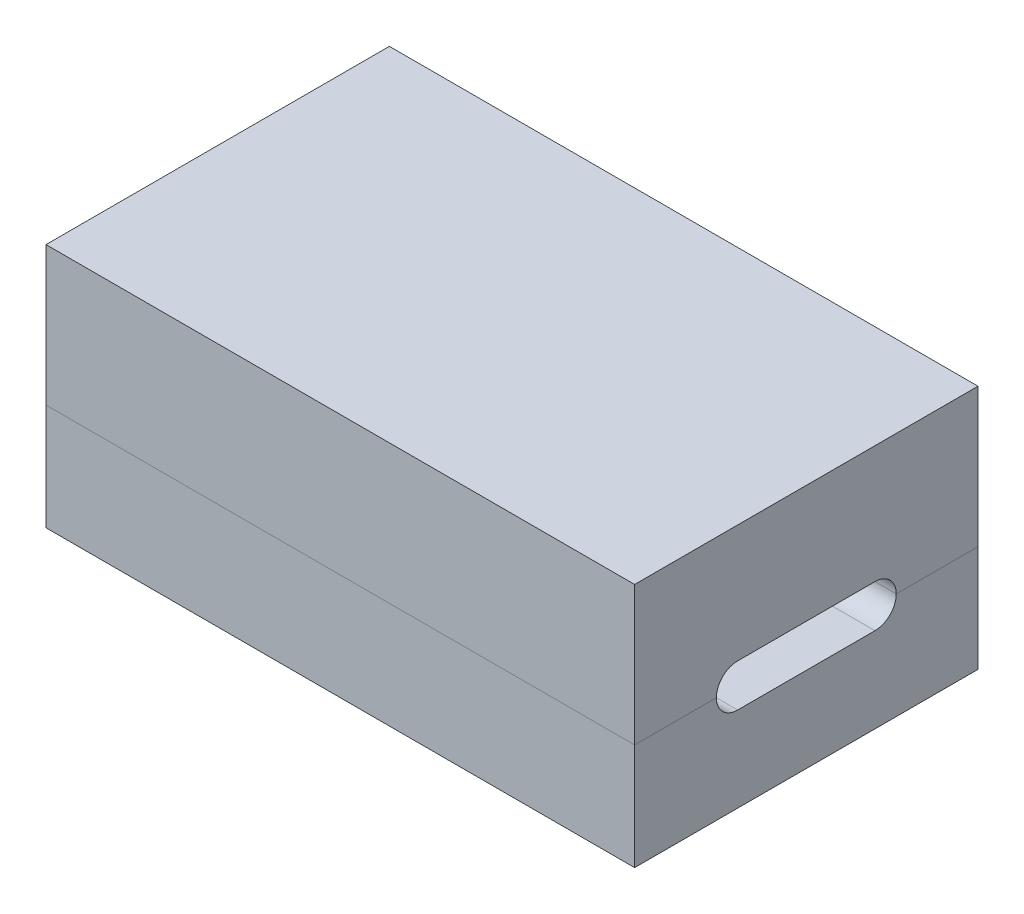
ISO-10303-21;
HEADER;
FILE_DESCRIPTION(('STEP AP214'),'2;1');
FILE_NAME('part.step','',(''),(''),'','','');
FILE_SCHEMA(('AUTOMOTIVE_DESIGN { 1 0 10303 214 1 1 1 1 }'));
ENDSEC;
DATA;
#1=APPLICATION_CONTEXT('core data for automotive mechanical design processes');
#2=APPLICATION_PROTOCOL_DEFINITION('international standard','automotive_design',2000,#1);
#3=PRODUCT_CONTEXT('',#1,'mechanical');
#4=PRODUCT('Part','Part','',(#3));
#5=PRODUCT_RELATED_PRODUCT_CATEGORY('part','',(#4));
#6=PRODUCT_DEFINITION_FORMATION('','',#4);
#7=PRODUCT_DEFINITION_CONTEXT('part definition',#1,'design');
#8=PRODUCT_DEFINITION('design','',#6,#7);
#9=PRODUCT_DEFINITION_SHAPE('','',#8);
#10=(LENGTH_UNIT() NAMED_UNIT(*) SI_UNIT(.MILLI.,.METRE.));
#11=(NAMED_UNIT(*) PLANE_ANGLE_UNIT() SI_UNIT($,.RADIAN.));
#12=(NAMED_UNIT(*) SI_UNIT($,.STERADIAN.) SOLID_ANGLE_UNIT());
#13=UNCERTAINTY_MEASURE_WITH_UNIT(LENGTH_MEASURE(1.E-05),#10,'distance_accuracy_value','');
#14=(GEOMETRIC_REPRESENTATION_CONTEXT(3) GLOBAL_UNCERTAINTY_ASSIGNED_CONTEXT((#13)) GLOBAL_UNIT_ASSIGNED_CONTEXT((#10,
#11,#12)) REPRESENTATION_CONTEXT('',''));
#15=CARTESIAN_POINT('',(0.,0.,0.));
#16=DIRECTION('',(0.,0.,1.));
#17=DIRECTION('',(1.,0.,0.));
#18=AXIS2_PLACEMENT_3D('',#15,#16,#17);
#19=CARTESIAN_POINT('',(0.,6.5,0.));
#20=DIRECTION('',(0.,1.,0.));
#21=DIRECTION('',(0.,0.,1.));
#22=AXIS2_PLACEMENT_3D('',#19,#20,#21);
#23=PLANE('',#22);
#24=DIRECTION('',(0.,0.,-1.));
#25=VECTOR('',#24,1.);
#26=CARTESIAN_POINT('',(15.,6.5,-7.5));
#27=LINE('',#26,#25);
#28=CARTESIAN_POINT('',(15.,6.5,-5.5));
#29=VERTEX_POINT('',#28);
#30=CARTESIAN_POINT('',(15.,6.5,-7.5));
#31=VERTEX_POINT('',#30);
#32=EDGE_CURVE('E169',#29,#31,#27,.T.);
#33=ORIENTED_EDGE('',*,*,#32,.F.);
#34=DIRECTION('',(1.,0.,0.));
#35=VECTOR('',#34,1.);
#36=CARTESIAN_POINT('',(3.,6.5,-5.5));
#37=LINE('',#36,#35);
#38=CARTESIAN_POINT('',(18.,6.5,-5.5));
#39=VERTEX_POINT('',#38);
#40=EDGE_CURVE('E181',#29,#39,#37,.T.);
#41=ORIENTED_EDGE('',*,*,#40,.T.);
#42=DIRECTION('',(0.,0.,-1.));
#43=VECTOR('',#42,1.);
#44=CARTESIAN_POINT('',(18.,6.5,-10.5));
#45=LINE('',#44,#43);
#46=CARTESIAN_POINT('',(18.,6.5,-10.5));
#47=VERTEX_POINT('',#46);
#48=EDGE_CURVE('E201',#39,#47,#45,.T.);
#49=ORIENTED_EDGE('',*,*,#48,.T.);
#50=DIRECTION('',(-1.,0.,0.));
#51=VECTOR('',#50,1.);
#52=CARTESIAN_POINT('',(-18.,6.5,-10.5));
#53=LINE('',#52,#51);
#54=CARTESIAN_POINT('',(-18.,6.5,-10.5));
#55=VERTEX_POINT('',#54);
#56=EDGE_CURVE('E205',#47,#55,#53,.T.);
#57=ORIENTED_EDGE('',*,*,#56,.T.);
#58=DIRECTION('',(0.,0.,1.));
#59=VECTOR('',#58,1.);
#60=CARTESIAN_POINT('',(-18.,6.5,-10.5));
#61=LINE('',#60,#59);
#62=CARTESIAN_POINT('',(-18.,6.5,10.5));
#63=VERTEX_POINT('',#62);
#64=EDGE_CURVE('E208',#55,#63,#61,.T.);
#65=ORIENTED_EDGE('',*,*,#64,.T.);
#66=DIRECTION('',(1.,0.,0.));
#67=VECTOR('',#66,1.);
#68=CARTESIAN_POINT('',(-18.,6.5,10.5));
#69=LINE('',#68,#67);
#70=CARTESIAN_POINT('',(18.,6.5,10.5));
#71=VERTEX_POINT('',#70);
#72=EDGE_CURVE('E211',#63,#71,#69,.T.);
#73=ORIENTED_EDGE('',*,*,#72,.T.);
#74=CARTESIAN_POINT('',(18.,6.5,5.5));
#75=VERTEX_POINT('',#74);
#76=EDGE_CURVE('E204',#71,#75,#45,.T.);
#77=ORIENTED_EDGE('',*,*,#76,.T.);
#78=DIRECTION('',(1.,0.,0.));
#79=VECTOR('',#78,1.);
#80=CARTESIAN_POINT('',(3.,6.5,5.5));
#81=LINE('',#80,#79);
#82=CARTESIAN_POINT('',(15.,6.5,5.5));
#83=VERTEX_POINT('',#82);
#84=EDGE_CURVE('E214',#75,#83,#81,.F.);
#85=ORIENTED_EDGE('',*,*,#84,.T.);
#86=CARTESIAN_POINT('',(15.,6.5,7.5));
#87=VERTEX_POINT('',#86);
#88=EDGE_CURVE('E161',#87,#83,#27,.T.);
#89=ORIENTED_EDGE('',*,*,#88,.F.);
#90=DIRECTION('',(1.,0.,0.));
#91=VECTOR('',#90,1.);
#92=CARTESIAN_POINT('',(-15.,6.5,7.5));
#93=LINE('',#92,#91);
#94=CARTESIAN_POINT('',(-15.,6.5,7.5));
#95=VERTEX_POINT('',#94);
#96=EDGE_CURVE('E167',#95,#87,#93,.T.);
#97=ORIENTED_EDGE('',*,*,#96,.F.);
#98=DIRECTION('',(0.,0.,1.));
#99=VECTOR('',#98,1.);
#100=CARTESIAN_POINT('',(-15.,6.5,-7.5));
#101=LINE('',#100,#99);
#102=CARTESIAN_POINT('',(-15.,6.5,-7.5));
#103=VERTEX_POINT('',#102);
#104=EDGE_CURVE('E141',#103,#95,#101,.T.);
#105=ORIENTED_EDGE('',*,*,#104,.F.);
#106=DIRECTION('',(-1.,0.,0.));
#107=VECTOR('',#106,1.);
#108=CARTESIAN_POINT('',(-15.,6.5,-7.5));
#109=LINE('',#108,#107);
#110=EDGE_CURVE('E158',#31,#103,#109,.T.);
#111=ORIENTED_EDGE('',*,*,#110,.F.);
#112=EDGE_LOOP('',(#33,#41,#49,#57,#65,#73,#77,#85,#89,#97,#105,#111));
#113=FACE_BOUND('',#112,.T.);
#114=ADVANCED_FACE('F45',(#113),#23,.T.);
#115=CARTESIAN_POINT('',(-18.,15.,-10.5));
#116=DIRECTION('',(0.,0.,1.));
#117=DIRECTION('',(1.,0.,0.));
#118=AXIS2_PLACEMENT_3D('',#115,#116,#117);
#119=PLANE('',#118);
#120=ORIENTED_EDGE('',*,*,#56,.F.);
#121=DIRECTION('',(0.,-1.,0.));
#122=VECTOR('',#121,1.);
#123=CARTESIAN_POINT('',(18.,15.,-10.5));
#124=LINE('',#123,#122);
#125=CARTESIAN_POINT('',(18.,0.,-10.5));
#126=VERTEX_POINT('',#125);
#127=EDGE_CURVE('E218',#47,#126,#124,.T.);
#128=ORIENTED_EDGE('',*,*,#127,.T.);
#129=DIRECTION('',(-1.,0.,0.));
#130=VECTOR('',#129,1.);
#131=CARTESIAN_POINT('',(-18.,0.,-10.5));
#132=LINE('',#131,#130);
#133=CARTESIAN_POINT('',(-18.,0.,-10.5));
#134=VERTEX_POINT('',#133);
#135=EDGE_CURVE('E189',#126,#134,#132,.T.);
#136=ORIENTED_EDGE('',*,*,#135,.T.);
#137=DIRECTION('',(0.,-1.,0.));
#138=VECTOR('',#137,1.);
#139=CARTESIAN_POINT('',(-18.,15.,-10.5));
#140=LINE('',#139,#138);
#141=EDGE_CURVE('E220',#55,#134,#140,.T.);
#142=ORIENTED_EDGE('',*,*,#141,.F.);
#143=EDGE_LOOP('',(#120,#128,#136,#142));
#144=FACE_BOUND('',#143,.T.);
#145=ADVANCED_FACE('F245',(#144),#119,.F.);
#146=CARTESIAN_POINT('',(18.,15.,-10.5));
#147=DIRECTION('',(-1.,0.,0.));
#148=DIRECTION('',(0.,0.,1.));
#149=AXIS2_PLACEMENT_3D('',#146,#147,#148);
#150=PLANE('',#149);
#151=ORIENTED_EDGE('',*,*,#76,.F.);
#152=DIRECTION('',(0.,-1.,0.));
#153=VECTOR('',#152,1.);
#154=CARTESIAN_POINT('',(18.,15.,10.5));
#155=LINE('',#154,#153);
#156=CARTESIAN_POINT('',(18.,0.,10.5));
#157=VERTEX_POINT('',#156);
#158=EDGE_CURVE('E186',#71,#157,#155,.T.);
#159=ORIENTED_EDGE('',*,*,#158,.T.);
#160=DIRECTION('',(0.,0.,-1.));
#161=VECTOR('',#160,1.);
#162=CARTESIAN_POINT('',(18.,0.,-10.5));
#163=LINE('',#162,#161);
#164=EDGE_CURVE('E192',#157,#126,#163,.T.);
#165=ORIENTED_EDGE('',*,*,#164,.T.);
#166=ORIENTED_EDGE('',*,*,#127,.F.);
#167=ORIENTED_EDGE('',*,*,#48,.F.);
#168=CARTESIAN_POINT('',(18.,6.5,-4.2));
#169=DIRECTION('',(1.,0.,0.));
#170=DIRECTION('',(0.,0.,-1.));
#171=AXIS2_PLACEMENT_3D('',#168,#169,#170);
#172=CIRCLE('',#171,1.3);
#173=CARTESIAN_POINT('',(18.,5.2,-4.2));
#174=VERTEX_POINT('',#173);
#175=EDGE_CURVE('E197',#174,#39,#172,.T.);
#176=ORIENTED_EDGE('',*,*,#175,.F.);
#177=DIRECTION('',(0.,0.,-1.));
#178=VECTOR('',#177,1.);
#179=CARTESIAN_POINT('',(18.,5.2,4.2));
#180=LINE('',#179,#178);
#181=CARTESIAN_POINT('',(18.,5.2,4.2));
#182=VERTEX_POINT('',#181);
#183=EDGE_CURVE('E199',#182,#174,#180,.T.);
#184=ORIENTED_EDGE('',*,*,#183,.F.);
#185=CARTESIAN_POINT('',(18.,6.5,4.2));
#186=DIRECTION('',(1.,0.,0.));
#187=DIRECTION('',(0.,0.,-1.));
#188=AXIS2_PLACEMENT_3D('',#185,#186,#187);
#189=CIRCLE('',#188,1.3);
#190=EDGE_CURVE('E53',#75,#182,#189,.T.);
#191=ORIENTED_EDGE('',*,*,#190,.F.);
#192=EDGE_LOOP('',(#151,#159,#165,#166,#167,#176,#184,#191));
#193=FACE_BOUND('',#192,.T.);
#194=ADVANCED_FACE('F235',(#193),#150,.F.);
#195=CARTESIAN_POINT('',(3.,5.2,4.2));
#196=DIRECTION('',(0.,-1.,0.));
#197=DIRECTION('',(0.,0.,-1.));
#198=AXIS2_PLACEMENT_3D('',#195,#196,#197);
#199=PLANE('',#198);
#200=DIRECTION('',(1.,0.,0.));
#201=VECTOR('',#200,1.);
#202=CARTESIAN_POINT('',(3.,5.2,-4.2));
#203=LINE('',#202,#201);
#204=CARTESIAN_POINT('',(15.,5.2,-4.2));
#205=VERTEX_POINT('',#204);
#206=EDGE_CURVE('E66',#205,#174,#203,.T.);
#207=ORIENTED_EDGE('',*,*,#206,.F.);
#208=DIRECTION('',(0.,0.,1.));
#209=VECTOR('',#208,1.);
#210=CARTESIAN_POINT('',(15.,5.2,4.2));
#211=LINE('',#210,#209);
#212=CARTESIAN_POINT('',(15.,5.2,4.2));
#213=VERTEX_POINT('',#212);
#214=EDGE_CURVE('E60',#205,#213,#211,.T.);
#215=ORIENTED_EDGE('',*,*,#214,.T.);
#216=DIRECTION('',(1.,0.,0.));
#217=VECTOR('',#216,1.);
#218=CARTESIAN_POINT('',(3.,5.2,4.2));
#219=LINE('',#218,#217);
#220=EDGE_CURVE('E195',#213,#182,#219,.T.);
#221=ORIENTED_EDGE('',*,*,#220,.T.);
#222=ORIENTED_EDGE('',*,*,#183,.T.);
#223=EDGE_LOOP('',(#207,#215,#221,#222));
#224=FACE_BOUND('',#223,.T.);
#225=ADVANCED_FACE('F238',(#224),#199,.F.);
#226=CARTESIAN_POINT('',(3.,6.5,4.2));
#227=DIRECTION('',(1.,0.,0.));
#228=DIRECTION('',(0.,0.,-1.));
#229=AXIS2_PLACEMENT_3D('',#226,#227,#228);
#230=CYLINDRICAL_SURFACE('',#229,1.3);
#231=ORIENTED_EDGE('',*,*,#220,.F.);
#232=CARTESIAN_POINT('',(15.,6.5,4.2));
#233=DIRECTION('',(1.,0.,0.));
#234=DIRECTION('',(0.,0.,-1.));
#235=AXIS2_PLACEMENT_3D('',#232,#233,#234);
#236=CIRCLE('',#235,1.3);
#237=EDGE_CURVE('E178',#213,#83,#236,.F.);
#238=ORIENTED_EDGE('',*,*,#237,.T.);
#239=ORIENTED_EDGE('',*,*,#84,.F.);
#240=ORIENTED_EDGE('',*,*,#190,.T.);
#241=EDGE_LOOP('',(#231,#238,#239,#240));
#242=FACE_BOUND('',#241,.T.);
#243=ADVANCED_FACE('F230',(#242),#230,.F.);
#244=CARTESIAN_POINT('',(3.,6.5,-4.2));
#245=DIRECTION('',(1.,0.,0.));
#246=DIRECTION('',(0.,0.,-1.));
#247=AXIS2_PLACEMENT_3D('',#244,#245,#246);
#248=CYLINDRICAL_SURFACE('',#247,1.3);
#249=ORIENTED_EDGE('',*,*,#40,.F.);
#250=CARTESIAN_POINT('',(15.,6.5,-4.2));
#251=DIRECTION('',(1.,0.,0.));
#252=DIRECTION('',(0.,0.,-1.));
#253=AXIS2_PLACEMENT_3D('',#250,#251,#252);
#254=CIRCLE('',#253,1.3);
#255=EDGE_CURVE('E12',#29,#205,#254,.F.);
#256=ORIENTED_EDGE('',*,*,#255,.T.);
#257=ORIENTED_EDGE('',*,*,#206,.T.);
#258=ORIENTED_EDGE('',*,*,#175,.T.);
#259=EDGE_LOOP('',(#249,#256,#257,#258));
#260=FACE_BOUND('',#259,.T.);
#261=ADVANCED_FACE('F47',(#260),#248,.F.);
#262=CARTESIAN_POINT('',(0.,0.,0.));
#263=DIRECTION('',(0.,1.,0.));
#264=DIRECTION('',(0.,0.,1.));
#265=AXIS2_PLACEMENT_3D('',#262,#263,#264);
#266=PLANE('',#265);
#267=ORIENTED_EDGE('',*,*,#164,.F.);
#268=DIRECTION('',(1.,0.,0.));
#269=VECTOR('',#268,1.);
#270=CARTESIAN_POINT('',(-18.,0.,10.5));
#271=LINE('',#270,#269);
#272=CARTESIAN_POINT('',(-18.,0.,10.5));
#273=VERTEX_POINT('',#272);
#274=EDGE_CURVE('E182',#273,#157,#271,.T.);
#275=ORIENTED_EDGE('',*,*,#274,.F.);
#276=DIRECTION('',(0.,0.,1.));
#277=VECTOR('',#276,1.);
#278=CARTESIAN_POINT('',(-18.,0.,-10.5));
#279=LINE('',#278,#277);
#280=EDGE_CURVE('E185',#134,#273,#279,.T.);
#281=ORIENTED_EDGE('',*,*,#280,.F.);
#282=ORIENTED_EDGE('',*,*,#135,.F.);
#283=EDGE_LOOP('',(#267,#275,#281,#282));
#284=FACE_BOUND('',#283,.T.);
#285=ADVANCED_FACE('F263',(#284),#266,.F.);
#286=CARTESIAN_POINT('',(-18.,15.,-10.5));
#287=DIRECTION('',(1.,0.,0.));
#288=DIRECTION('',(0.,0.,-1.));
#289=AXIS2_PLACEMENT_3D('',#286,#287,#288);
#290=PLANE('',#289);
#291=ORIENTED_EDGE('',*,*,#64,.F.);
#292=ORIENTED_EDGE('',*,*,#141,.T.);
#293=ORIENTED_EDGE('',*,*,#280,.T.);
#294=DIRECTION('',(0.,-1.,0.));
#295=VECTOR('',#294,1.);
#296=CARTESIAN_POINT('',(-18.,15.,10.5));
#297=LINE('',#296,#295);
#298=EDGE_CURVE('E222',#63,#273,#297,.T.);
#299=ORIENTED_EDGE('',*,*,#298,.F.);
#300=EDGE_LOOP('',(#291,#292,#293,#299));
#301=FACE_BOUND('',#300,.T.);
#302=ADVANCED_FACE('F260',(#301),#290,.F.);
#303=CARTESIAN_POINT('',(-18.,15.,10.5));
#304=DIRECTION('',(0.,0.,-1.));
#305=DIRECTION('',(-1.,0.,0.));
#306=AXIS2_PLACEMENT_3D('',#303,#304,#305);
#307=PLANE('',#306);
#308=ORIENTED_EDGE('',*,*,#72,.F.);
#309=ORIENTED_EDGE('',*,*,#298,.T.);
#310=ORIENTED_EDGE('',*,*,#274,.T.);
#311=ORIENTED_EDGE('',*,*,#158,.F.);
#312=EDGE_LOOP('',(#308,#309,#310,#311));
#313=FACE_BOUND('',#312,.T.);
#314=ADVANCED_FACE('F257',(#313),#307,.F.);
#315=CARTESIAN_POINT('',(15.,3.,-7.5));
#316=DIRECTION('',(1.,0.,0.));
#317=DIRECTION('',(0.,0.,-1.));
#318=AXIS2_PLACEMENT_3D('',#315,#316,#317);
#319=PLANE('',#318);
#320=ORIENTED_EDGE('',*,*,#214,.F.);
#321=ORIENTED_EDGE('',*,*,#255,.F.);
#322=ORIENTED_EDGE('',*,*,#32,.T.);
#323=DIRECTION('',(0.,1.,0.));
#324=VECTOR('',#323,1.);
#325=CARTESIAN_POINT('',(15.,3.,-7.5));
#326=LINE('',#325,#324);
#327=CARTESIAN_POINT('',(15.,3.,-7.5));
#328=VERTEX_POINT('',#327);
#329=EDGE_CURVE('E173',#328,#31,#326,.T.);
#330=ORIENTED_EDGE('',*,*,#329,.F.);
#331=DIRECTION('',(0.,0.,-1.));
#332=VECTOR('',#331,1.);
#333=CARTESIAN_POINT('',(15.,3.,-7.5));
#334=LINE('',#333,#332);
#335=CARTESIAN_POINT('',(15.,3.,7.5));
#336=VERTEX_POINT('',#335);
#337=EDGE_CURVE('E154',#336,#328,#334,.T.);
#338=ORIENTED_EDGE('',*,*,#337,.F.);
#339=DIRECTION('',(0.,1.,0.));
#340=VECTOR('',#339,1.);
#341=CARTESIAN_POINT('',(15.,3.,7.5));
#342=LINE('',#341,#340);
#343=EDGE_CURVE('E145',#336,#87,#342,.T.);
#344=ORIENTED_EDGE('',*,*,#343,.T.);
#345=ORIENTED_EDGE('',*,*,#88,.T.);
#346=ORIENTED_EDGE('',*,*,#237,.F.);
#347=EDGE_LOOP('',(#320,#321,#322,#330,#338,#344,#345,#346));
#348=FACE_BOUND('',#347,.T.);
#349=ADVANCED_FACE('F256',(#348),#319,.F.);
#350=CARTESIAN_POINT('',(-15.,3.,-7.5));
#351=DIRECTION('',(-1.,0.,0.));
#352=DIRECTION('',(0.,0.,1.));
#353=AXIS2_PLACEMENT_3D('',#350,#351,#352);
#354=PLANE('',#353);
#355=ORIENTED_EDGE('',*,*,#104,.T.);
#356=DIRECTION('',(0.,1.,0.));
#357=VECTOR('',#356,1.);
#358=CARTESIAN_POINT('',(-15.,3.,7.5));
#359=LINE('',#358,#357);
#360=CARTESIAN_POINT('',(-15.,3.,7.5));
#361=VERTEX_POINT('',#360);
#362=EDGE_CURVE('E134',#361,#95,#359,.T.);
#363=ORIENTED_EDGE('',*,*,#362,.F.);
#364=DIRECTION('',(0.,0.,1.));
#365=VECTOR('',#364,1.);
#366=CARTESIAN_POINT('',(-15.,3.,-7.5));
#367=LINE('',#366,#365);
#368=CARTESIAN_POINT('',(-15.,3.,-7.5));
#369=VERTEX_POINT('',#368);
#370=EDGE_CURVE('E138',#369,#361,#367,.T.);
#371=ORIENTED_EDGE('',*,*,#370,.F.);
#372=DIRECTION('',(0.,1.,0.));
#373=VECTOR('',#372,1.);
#374=CARTESIAN_POINT('',(-15.,3.,-7.5));
#375=LINE('',#374,#373);
#376=EDGE_CURVE('E171',#369,#103,#375,.T.);
#377=ORIENTED_EDGE('',*,*,#376,.T.);
#378=EDGE_LOOP('',(#355,#363,#371,#377));
#379=FACE_BOUND('',#378,.T.);
#380=ADVANCED_FACE('F136',(#379),#354,.F.);
#381=CARTESIAN_POINT('',(-15.,3.,-7.5));
#382=DIRECTION('',(0.,0.,-1.));
#383=DIRECTION('',(-1.,0.,0.));
#384=AXIS2_PLACEMENT_3D('',#381,#382,#383);
#385=PLANE('',#384);
#386=ORIENTED_EDGE('',*,*,#110,.T.);
#387=ORIENTED_EDGE('',*,*,#376,.F.);
#388=DIRECTION('',(-1.,0.,0.));
#389=VECTOR('',#388,1.);
#390=CARTESIAN_POINT('',(-15.,3.,-7.5));
#391=LINE('',#390,#389);
#392=EDGE_CURVE('E146',#328,#369,#391,.T.);
#393=ORIENTED_EDGE('',*,*,#392,.F.);
#394=ORIENTED_EDGE('',*,*,#329,.T.);
#395=EDGE_LOOP('',(#386,#387,#393,#394));
#396=FACE_BOUND('',#395,.T.);
#397=ADVANCED_FACE('F290',(#396),#385,.F.);
#398=CARTESIAN_POINT('',(-15.,3.,7.5));
#399=DIRECTION('',(0.,0.,1.));
#400=DIRECTION('',(1.,0.,0.));
#401=AXIS2_PLACEMENT_3D('',#398,#399,#400);
#402=PLANE('',#401);
#403=ORIENTED_EDGE('',*,*,#96,.T.);
#404=ORIENTED_EDGE('',*,*,#343,.F.);
#405=DIRECTION('',(1.,0.,0.));
#406=VECTOR('',#405,1.);
#407=CARTESIAN_POINT('',(-15.,3.,7.5));
#408=LINE('',#407,#406);
#409=EDGE_CURVE('E149',#361,#336,#408,.T.);
#410=ORIENTED_EDGE('',*,*,#409,.F.);
#411=ORIENTED_EDGE('',*,*,#362,.T.);
#412=EDGE_LOOP('',(#403,#404,#410,#411));
#413=FACE_BOUND('',#412,.T.);
#414=ADVANCED_FACE('F150',(#413),#402,.F.);
#415=CARTESIAN_POINT('',(0.,3.,0.));
#416=DIRECTION('',(0.,1.,0.));
#417=DIRECTION('',(0.,0.,1.));
#418=AXIS2_PLACEMENT_3D('',#415,#416,#417);
#419=PLANE('',#418);
#420=ORIENTED_EDGE('',*,*,#370,.T.);
#421=ORIENTED_EDGE('',*,*,#409,.T.);
#422=ORIENTED_EDGE('',*,*,#337,.T.);
#423=ORIENTED_EDGE('',*,*,#392,.T.);
#424=EDGE_LOOP('',(#420,#421,#422,#423));
#425=FACE_BOUND('',#424,.T.);
#426=ADVANCED_FACE('F156',(#425),#419,.T.);
#427=CLOSED_SHELL('',(#114,#145,#194,#225,#243,#261,#285,#302,#314,#349,#380,#397,#414,#426));
#428=MANIFOLD_SOLID_BREP('B2_NOT_SHOWN',#427);
#429=CARTESIAN_POINT('',(0.,6.5,0.));
#430=DIRECTION('',(0.,1.,0.));
#431=DIRECTION('',(0.,0.,1.));
#432=AXIS2_PLACEMENT_3D('',#429,#430,#431);
#433=PLANE('',#432);
#434=DIRECTION('',(-1.,0.,0.));
#435=VECTOR('',#434,1.);
#436=CARTESIAN_POINT('',(-15.,6.5,7.5));
#437=LINE('',#436,#435);
#438=CARTESIAN_POINT('',(15.,6.5,7.5));
#439=VERTEX_POINT('',#438);
#440=CARTESIAN_POINT('',(-15.,6.5,7.5));
#441=VERTEX_POINT('',#440);
#442=EDGE_CURVE('E487',#439,#441,#437,.T.);
#443=ORIENTED_EDGE('',*,*,#442,.F.);
#444=DIRECTION('',(0.,0.,1.));
#445=VECTOR('',#444,1.);
#446=CARTESIAN_POINT('',(15.,6.5,7.5));
#447=LINE('',#446,#445);
#448=CARTESIAN_POINT('',(15.,6.5,5.5));
#449=VERTEX_POINT('',#448);
#450=EDGE_CURVE('E497',#449,#439,#447,.T.);
#451=ORIENTED_EDGE('',*,*,#450,.F.);
#452=DIRECTION('',(1.,0.,0.));
#453=VECTOR('',#452,1.);
#454=CARTESIAN_POINT('',(3.,6.5,5.5));
#455=LINE('',#454,#453);
#456=CARTESIAN_POINT('',(18.,6.5,5.5));
#457=VERTEX_POINT('',#456);
#458=EDGE_CURVE('E547',#457,#449,#455,.F.);
#459=ORIENTED_EDGE('',*,*,#458,.F.);
#460=DIRECTION('',(0.,0.,-1.));
#461=VECTOR('',#460,1.);
#462=CARTESIAN_POINT('',(18.,6.5,-10.5));
#463=LINE('',#462,#461);
#464=CARTESIAN_POINT('',(18.,6.5,10.5));
#465=VERTEX_POINT('',#464);
#466=EDGE_CURVE('E382',#465,#457,#463,.T.);
#467=ORIENTED_EDGE('',*,*,#466,.F.);
#468=DIRECTION('',(1.,0.,0.));
#469=VECTOR('',#468,1.);
#470=CARTESIAN_POINT('',(-18.,6.5,10.5));
#471=LINE('',#470,#469);
#472=CARTESIAN_POINT('',(-18.,6.5,10.5));
#473=VERTEX_POINT('',#472);
#474=EDGE_CURVE('E550',#473,#465,#471,.T.);
#475=ORIENTED_EDGE('',*,*,#474,.F.);
#476=DIRECTION('',(0.,0.,1.));
#477=VECTOR('',#476,1.);
#478=CARTESIAN_POINT('',(-18.,6.5,-10.5));
#479=LINE('',#478,#477);
#480=CARTESIAN_POINT('',(-18.,6.5,-10.5));
#481=VERTEX_POINT('',#480);
#482=EDGE_CURVE('E554',#481,#473,#479,.T.);
#483=ORIENTED_EDGE('',*,*,#482,.F.);
#484=DIRECTION('',(-1.,0.,0.));
#485=VECTOR('',#484,1.);
#486=CARTESIAN_POINT('',(-18.,6.5,-10.5));
#487=LINE('',#486,#485);
#488=CARTESIAN_POINT('',(18.,6.5,-10.5));
#489=VERTEX_POINT('',#488);
#490=EDGE_CURVE('E396',#489,#481,#487,.T.);
#491=ORIENTED_EDGE('',*,*,#490,.F.);
#492=CARTESIAN_POINT('',(18.,6.5,-5.5));
#493=VERTEX_POINT('',#492);
#494=EDGE_CURVE('E552',#493,#489,#463,.T.);
#495=ORIENTED_EDGE('',*,*,#494,.F.);
#496=DIRECTION('',(1.,0.,0.));
#497=VECTOR('',#496,1.);
#498=CARTESIAN_POINT('',(3.,6.5,-5.5));
#499=LINE('',#498,#497);
#500=CARTESIAN_POINT('',(15.,6.5,-5.5));
#501=VERTEX_POINT('',#500);
#502=EDGE_CURVE('E545',#501,#493,#499,.T.);
#503=ORIENTED_EDGE('',*,*,#502,.F.);
#504=CARTESIAN_POINT('',(15.,6.5,-7.5));
#505=VERTEX_POINT('',#504);
#506=EDGE_CURVE('E389',#505,#501,#447,.T.);
#507=ORIENTED_EDGE('',*,*,#506,.F.);
#508=DIRECTION('',(1.,0.,0.));
#509=VECTOR('',#508,1.);
#510=CARTESIAN_POINT('',(-15.,6.5,-7.5));
#511=LINE('',#510,#509);
#512=CARTESIAN_POINT('',(-15.,6.5,-7.5));
#513=VERTEX_POINT('',#512);
#514=EDGE_CURVE('E495',#513,#505,#511,.T.);
#515=ORIENTED_EDGE('',*,*,#514,.F.);
#516=DIRECTION('',(0.,0.,-1.));
#517=VECTOR('',#516,1.);
#518=CARTESIAN_POINT('',(-15.,6.5,7.5));
#519=LINE('',#518,#517);
#520=EDGE_CURVE('E470',#441,#513,#519,.T.);
#521=ORIENTED_EDGE('',*,*,#520,.F.);
#522=EDGE_LOOP('',(#443,#451,#459,#467,#475,#483,#491,#495,#503,#507,#515,#521));
#523=FACE_BOUND('',#522,.T.);
#524=ADVANCED_FACE('F375',(#523),#433,.F.);
#525=CARTESIAN_POINT('',(18.,15.,-10.5));
#526=DIRECTION('',(-1.,0.,0.));
#527=DIRECTION('',(0.,0.,1.));
#528=AXIS2_PLACEMENT_3D('',#525,#526,#527);
#529=PLANE('',#528);
#530=DIRECTION('',(0.,-1.,0.));
#531=VECTOR('',#530,1.);
#532=CARTESIAN_POINT('',(18.,15.,10.5));
#533=LINE('',#532,#531);
#534=CARTESIAN_POINT('',(18.,15.,10.5));
#535=VERTEX_POINT('',#534);
#536=EDGE_CURVE('E533',#535,#465,#533,.T.);
#537=ORIENTED_EDGE('',*,*,#536,.T.);
#538=ORIENTED_EDGE('',*,*,#466,.T.);
#539=CARTESIAN_POINT('',(18.,6.5,4.2));
#540=DIRECTION('',(1.,0.,0.));
#541=DIRECTION('',(0.,0.,-1.));
#542=AXIS2_PLACEMENT_3D('',#539,#540,#541);
#543=CIRCLE('',#542,1.3);
#544=CARTESIAN_POINT('',(18.,7.8,4.2));
#545=VERTEX_POINT('',#544);
#546=EDGE_CURVE('E511',#545,#457,#543,.T.);
#547=ORIENTED_EDGE('',*,*,#546,.F.);
#548=DIRECTION('',(0.,0.,1.));
#549=VECTOR('',#548,1.);
#550=CARTESIAN_POINT('',(18.,7.8,4.2));
#551=LINE('',#550,#549);
#552=CARTESIAN_POINT('',(18.,7.8,-4.2));
#553=VERTEX_POINT('',#552);
#554=EDGE_CURVE('E517',#553,#545,#551,.T.);
#555=ORIENTED_EDGE('',*,*,#554,.F.);
#556=CARTESIAN_POINT('',(18.,6.5,-4.2));
#557=DIRECTION('',(1.,0.,0.));
#558=DIRECTION('',(0.,0.,-1.));
#559=AXIS2_PLACEMENT_3D('',#556,#557,#558);
#560=CIRCLE('',#559,1.3);
#561=EDGE_CURVE('E514',#493,#553,#560,.T.);
#562=ORIENTED_EDGE('',*,*,#561,.F.);
#563=ORIENTED_EDGE('',*,*,#494,.T.);
#564=DIRECTION('',(0.,-1.,0.));
#565=VECTOR('',#564,1.);
#566=CARTESIAN_POINT('',(18.,15.,-10.5));
#567=LINE('',#566,#565);
#568=CARTESIAN_POINT('',(18.,15.,-10.5));
#569=VERTEX_POINT('',#568);
#570=EDGE_CURVE('E542',#569,#489,#567,.T.);
#571=ORIENTED_EDGE('',*,*,#570,.F.);
#572=DIRECTION('',(0.,0.,-1.));
#573=VECTOR('',#572,1.);
#574=CARTESIAN_POINT('',(18.,15.,-10.5));
#575=LINE('',#574,#573);
#576=EDGE_CURVE('E523',#535,#569,#575,.T.);
#577=ORIENTED_EDGE('',*,*,#576,.F.);
#578=EDGE_LOOP('',(#537,#538,#547,#555,#562,#563,#571,#577));
#579=FACE_BOUND('',#578,.T.);
#580=ADVANCED_FACE('F560',(#579),#529,.F.);
#581=CARTESIAN_POINT('',(-18.,15.,-10.5));
#582=DIRECTION('',(0.,0.,1.));
#583=DIRECTION('',(1.,0.,0.));
#584=AXIS2_PLACEMENT_3D('',#581,#582,#583);
#585=PLANE('',#584);
#586=ORIENTED_EDGE('',*,*,#570,.T.);
#587=ORIENTED_EDGE('',*,*,#490,.T.);
#588=DIRECTION('',(0.,-1.,0.));
#589=VECTOR('',#588,1.);
#590=CARTESIAN_POINT('',(-18.,15.,-10.5));
#591=LINE('',#590,#589);
#592=CARTESIAN_POINT('',(-18.,15.,-10.5));
#593=VERTEX_POINT('',#592);
#594=EDGE_CURVE('E539',#593,#481,#591,.T.);
#595=ORIENTED_EDGE('',*,*,#594,.F.);
#596=DIRECTION('',(-1.,0.,0.));
#597=VECTOR('',#596,1.);
#598=CARTESIAN_POINT('',(-18.,15.,-10.5));
#599=LINE('',#598,#597);
#600=EDGE_CURVE('E527',#569,#593,#599,.T.);
#601=ORIENTED_EDGE('',*,*,#600,.F.);
#602=EDGE_LOOP('',(#586,#587,#595,#601));
#603=FACE_BOUND('',#602,.T.);
#604=ADVANCED_FACE('F564',(#603),#585,.F.);
#605=CARTESIAN_POINT('',(-18.,15.,-10.5));
#606=DIRECTION('',(1.,0.,0.));
#607=DIRECTION('',(0.,0.,-1.));
#608=AXIS2_PLACEMENT_3D('',#605,#606,#607);
#609=PLANE('',#608);
#610=ORIENTED_EDGE('',*,*,#594,.T.);
#611=ORIENTED_EDGE('',*,*,#482,.T.);
#612=DIRECTION('',(0.,-1.,0.));
#613=VECTOR('',#612,1.);
#614=CARTESIAN_POINT('',(-18.,15.,10.5));
#615=LINE('',#614,#613);
#616=CARTESIAN_POINT('',(-18.,15.,10.5));
#617=VERTEX_POINT('',#616);
#618=EDGE_CURVE('E536',#617,#473,#615,.T.);
#619=ORIENTED_EDGE('',*,*,#618,.F.);
#620=DIRECTION('',(0.,0.,1.));
#621=VECTOR('',#620,1.);
#622=CARTESIAN_POINT('',(-18.,15.,-10.5));
#623=LINE('',#622,#621);
#624=EDGE_CURVE('E529',#593,#617,#623,.T.);
#625=ORIENTED_EDGE('',*,*,#624,.F.);
#626=EDGE_LOOP('',(#610,#611,#619,#625));
#627=FACE_BOUND('',#626,.T.);
#628=ADVANCED_FACE('F617',(#627),#609,.F.);
#629=CARTESIAN_POINT('',(-18.,15.,10.5));
#630=DIRECTION('',(0.,0.,-1.));
#631=DIRECTION('',(-1.,0.,0.));
#632=AXIS2_PLACEMENT_3D('',#629,#630,#631);
#633=PLANE('',#632);
#634=ORIENTED_EDGE('',*,*,#618,.T.);
#635=ORIENTED_EDGE('',*,*,#474,.T.);
#636=ORIENTED_EDGE('',*,*,#536,.F.);
#637=DIRECTION('',(1.,0.,0.));
#638=VECTOR('',#637,1.);
#639=CARTESIAN_POINT('',(-18.,15.,10.5));
#640=LINE('',#639,#638);
#641=EDGE_CURVE('E531',#617,#535,#640,.T.);
#642=ORIENTED_EDGE('',*,*,#641,.F.);
#643=EDGE_LOOP('',(#634,#635,#636,#642));
#644=FACE_BOUND('',#643,.T.);
#645=ADVANCED_FACE('F574',(#644),#633,.F.);
#646=CARTESIAN_POINT('',(0.,15.,0.));
#647=DIRECTION('',(0.,1.,0.));
#648=DIRECTION('',(0.,0.,1.));
#649=AXIS2_PLACEMENT_3D('',#646,#647,#648);
#650=PLANE('',#649);
#651=ORIENTED_EDGE('',*,*,#576,.T.);
#652=ORIENTED_EDGE('',*,*,#600,.T.);
#653=ORIENTED_EDGE('',*,*,#624,.T.);
#654=ORIENTED_EDGE('',*,*,#641,.T.);
#655=EDGE_LOOP('',(#651,#652,#653,#654));
#656=FACE_BOUND('',#655,.T.);
#657=ADVANCED_FACE('F567',(#656),#650,.T.);
#658=CARTESIAN_POINT('',(3.,6.5,4.2));
#659=DIRECTION('',(1.,0.,0.));
#660=DIRECTION('',(0.,0.,-1.));
#661=AXIS2_PLACEMENT_3D('',#658,#659,#660);
#662=CYLINDRICAL_SURFACE('',#661,1.3);
#663=ORIENTED_EDGE('',*,*,#458,.T.);
#664=CARTESIAN_POINT('',(15.,6.5,4.2));
#665=DIRECTION('',(1.,0.,0.));
#666=DIRECTION('',(0.,0.,-1.));
#667=AXIS2_PLACEMENT_3D('',#664,#665,#666);
#668=CIRCLE('',#667,1.3);
#669=CARTESIAN_POINT('',(15.,7.8,4.2));
#670=VERTEX_POINT('',#669);
#671=EDGE_CURVE('E508',#449,#670,#668,.F.);
#672=ORIENTED_EDGE('',*,*,#671,.T.);
#673=DIRECTION('',(1.,0.,0.));
#674=VECTOR('',#673,1.);
#675=CARTESIAN_POINT('',(3.,7.8,4.2));
#676=LINE('',#675,#674);
#677=EDGE_CURVE('E521',#670,#545,#676,.T.);
#678=ORIENTED_EDGE('',*,*,#677,.T.);
#679=ORIENTED_EDGE('',*,*,#546,.T.);
#680=EDGE_LOOP('',(#663,#672,#678,#679));
#681=FACE_BOUND('',#680,.T.);
#682=ADVANCED_FACE('F580',(#681),#662,.F.);
#683=CARTESIAN_POINT('',(3.,7.8,4.2));
#684=DIRECTION('',(0.,1.,0.));
#685=DIRECTION('',(0.,0.,1.));
#686=AXIS2_PLACEMENT_3D('',#683,#684,#685);
#687=PLANE('',#686);
#688=ORIENTED_EDGE('',*,*,#677,.F.);
#689=DIRECTION('',(0.,0.,-1.));
#690=VECTOR('',#689,1.);
#691=CARTESIAN_POINT('',(15.,7.8,4.20000000000001));
#692=LINE('',#691,#690);
#693=CARTESIAN_POINT('',(15.,7.8,-4.2));
#694=VERTEX_POINT('',#693);
#695=EDGE_CURVE('E501',#670,#694,#692,.T.);
#696=ORIENTED_EDGE('',*,*,#695,.T.);
#697=DIRECTION('',(1.,0.,0.));
#698=VECTOR('',#697,1.);
#699=CARTESIAN_POINT('',(3.,7.8,-4.2));
#700=LINE('',#699,#698);
#701=EDGE_CURVE('E520',#694,#553,#700,.T.);
#702=ORIENTED_EDGE('',*,*,#701,.T.);
#703=ORIENTED_EDGE('',*,*,#554,.T.);
#704=EDGE_LOOP('',(#688,#696,#702,#703));
#705=FACE_BOUND('',#704,.T.);
#706=ADVANCED_FACE('F583',(#705),#687,.F.);
#707=CARTESIAN_POINT('',(3.,6.5,-4.2));
#708=DIRECTION('',(1.,0.,0.));
#709=DIRECTION('',(0.,0.,-1.));
#710=AXIS2_PLACEMENT_3D('',#707,#708,#709);
#711=CYLINDRICAL_SURFACE('',#710,1.3);
#712=ORIENTED_EDGE('',*,*,#701,.F.);
#713=CARTESIAN_POINT('',(15.,6.5,-4.2));
#714=DIRECTION('',(1.,0.,0.));
#715=DIRECTION('',(0.,0.,-1.));
#716=AXIS2_PLACEMENT_3D('',#713,#714,#715);
#717=CIRCLE('',#716,1.3);
#718=EDGE_CURVE('E43',#694,#501,#717,.F.);
#719=ORIENTED_EDGE('',*,*,#718,.T.);
#720=ORIENTED_EDGE('',*,*,#502,.T.);
#721=ORIENTED_EDGE('',*,*,#561,.T.);
#722=EDGE_LOOP('',(#712,#719,#720,#721));
#723=FACE_BOUND('',#722,.T.);
#724=ADVANCED_FACE('F586',(#723),#711,.F.);
#725=CARTESIAN_POINT('',(15.,12.,7.5));
#726=DIRECTION('',(1.,0.,0.));
#727=DIRECTION('',(0.,0.,-1.));
#728=AXIS2_PLACEMENT_3D('',#725,#726,#727);
#729=PLANE('',#728);
#730=ORIENTED_EDGE('',*,*,#450,.T.);
#731=DIRECTION('',(0.,-1.,0.));
#732=VECTOR('',#731,1.);
#733=CARTESIAN_POINT('',(15.,12.,7.5));
#734=LINE('',#733,#732);
#735=CARTESIAN_POINT('',(15.,12.,7.5));
#736=VERTEX_POINT('',#735);
#737=EDGE_CURVE('E502',#736,#439,#734,.T.);
#738=ORIENTED_EDGE('',*,*,#737,.F.);
#739=DIRECTION('',(0.,0.,1.));
#740=VECTOR('',#739,1.);
#741=CARTESIAN_POINT('',(15.,12.,7.5));
#742=LINE('',#741,#740);
#743=CARTESIAN_POINT('',(15.,12.,-7.5));
#744=VERTEX_POINT('',#743);
#745=EDGE_CURVE('E483',#744,#736,#742,.T.);
#746=ORIENTED_EDGE('',*,*,#745,.F.);
#747=DIRECTION('',(0.,-1.,0.));
#748=VECTOR('',#747,1.);
#749=CARTESIAN_POINT('',(15.,12.,-7.5));
#750=LINE('',#749,#748);
#751=EDGE_CURVE('E474',#744,#505,#750,.T.);
#752=ORIENTED_EDGE('',*,*,#751,.T.);
#753=ORIENTED_EDGE('',*,*,#506,.T.);
#754=ORIENTED_EDGE('',*,*,#718,.F.);
#755=ORIENTED_EDGE('',*,*,#695,.F.);
#756=ORIENTED_EDGE('',*,*,#671,.F.);
#757=EDGE_LOOP('',(#730,#738,#746,#752,#753,#754,#755,#756));
#758=FACE_BOUND('',#757,.T.);
#759=ADVANCED_FACE('F589',(#758),#729,.F.);
#760=CARTESIAN_POINT('',(-15.,12.,7.5));
#761=DIRECTION('',(-1.,0.,0.));
#762=DIRECTION('',(0.,0.,1.));
#763=AXIS2_PLACEMENT_3D('',#760,#761,#762);
#764=PLANE('',#763);
#765=ORIENTED_EDGE('',*,*,#520,.T.);
#766=DIRECTION('',(0.,-1.,0.));
#767=VECTOR('',#766,1.);
#768=CARTESIAN_POINT('',(-15.,12.,-7.5));
#769=LINE('',#768,#767);
#770=CARTESIAN_POINT('',(-15.,12.,-7.5));
#771=VERTEX_POINT('',#770);
#772=EDGE_CURVE('E463',#771,#513,#769,.T.);
#773=ORIENTED_EDGE('',*,*,#772,.F.);
#774=DIRECTION('',(0.,0.,-1.));
#775=VECTOR('',#774,1.);
#776=CARTESIAN_POINT('',(-15.,12.,7.5));
#777=LINE('',#776,#775);
#778=CARTESIAN_POINT('',(-15.,12.,7.5));
#779=VERTEX_POINT('',#778);
#780=EDGE_CURVE('E467',#779,#771,#777,.T.);
#781=ORIENTED_EDGE('',*,*,#780,.F.);
#782=DIRECTION('',(0.,-1.,0.));
#783=VECTOR('',#782,1.);
#784=CARTESIAN_POINT('',(-15.,12.,7.5));
#785=LINE('',#784,#783);
#786=EDGE_CURVE('E499',#779,#441,#785,.T.);
#787=ORIENTED_EDGE('',*,*,#786,.T.);
#788=EDGE_LOOP('',(#765,#773,#781,#787));
#789=FACE_BOUND('',#788,.T.);
#790=ADVANCED_FACE('F465',(#789),#764,.F.);
#791=CARTESIAN_POINT('',(-15.,12.,7.5));
#792=DIRECTION('',(0.,0.,1.));
#793=DIRECTION('',(1.,0.,0.));
#794=AXIS2_PLACEMENT_3D('',#791,#792,#793);
#795=PLANE('',#794);
#796=ORIENTED_EDGE('',*,*,#442,.T.);
#797=ORIENTED_EDGE('',*,*,#786,.F.);
#798=DIRECTION('',(-1.,0.,0.));
#799=VECTOR('',#798,1.);
#800=CARTESIAN_POINT('',(-15.,12.,7.5));
#801=LINE('',#800,#799);
#802=EDGE_CURVE('E475',#736,#779,#801,.T.);
#803=ORIENTED_EDGE('',*,*,#802,.F.);
#804=ORIENTED_EDGE('',*,*,#737,.T.);
#805=EDGE_LOOP('',(#796,#797,#803,#804));
#806=FACE_BOUND('',#805,.T.);
#807=ADVANCED_FACE('F588',(#806),#795,.F.);
#808=CARTESIAN_POINT('',(-15.,12.,-7.5));
#809=DIRECTION('',(0.,0.,-1.));
#810=DIRECTION('',(-1.,0.,0.));
#811=AXIS2_PLACEMENT_3D('',#808,#809,#810);
#812=PLANE('',#811);
#813=ORIENTED_EDGE('',*,*,#514,.T.);
#814=ORIENTED_EDGE('',*,*,#751,.F.);
#815=DIRECTION('',(1.,0.,0.));
#816=VECTOR('',#815,1.);
#817=CARTESIAN_POINT('',(-15.,12.,-7.5));
#818=LINE('',#817,#816);
#819=EDGE_CURVE('E478',#771,#744,#818,.T.);
#820=ORIENTED_EDGE('',*,*,#819,.F.);
#821=ORIENTED_EDGE('',*,*,#772,.T.);
#822=EDGE_LOOP('',(#813,#814,#820,#821));
#823=FACE_BOUND('',#822,.T.);
#824=ADVANCED_FACE('F479',(#823),#812,.F.);
#825=CARTESIAN_POINT('',(0.,12.,0.));
#826=DIRECTION('',(0.,-1.,0.));
#827=DIRECTION('',(0.,0.,-1.));
#828=AXIS2_PLACEMENT_3D('',#825,#826,#827);
#829=PLANE('',#828);
#830=ORIENTED_EDGE('',*,*,#780,.T.);
#831=ORIENTED_EDGE('',*,*,#819,.T.);
#832=ORIENTED_EDGE('',*,*,#745,.T.);
#833=ORIENTED_EDGE('',*,*,#802,.T.);
#834=EDGE_LOOP('',(#830,#831,#832,#833));
#835=FACE_BOUND('',#834,.T.);
#836=ADVANCED_FACE('F485',(#835),#829,.T.);
#837=CLOSED_SHELL('',(#524,#580,#604,#628,#645,#657,#682,#706,#724,#759,#790,#807,#824,#836));
#838=MANIFOLD_SOLID_BREP('B6',#837);
#839=ADVANCED_BREP_SHAPE_REPRESENTATION('',(#18,#428,#838),#14);
#840=SHAPE_DEFINITION_REPRESENTATION(#9,#839);
ENDSEC;
END-ISO-10303-21;
